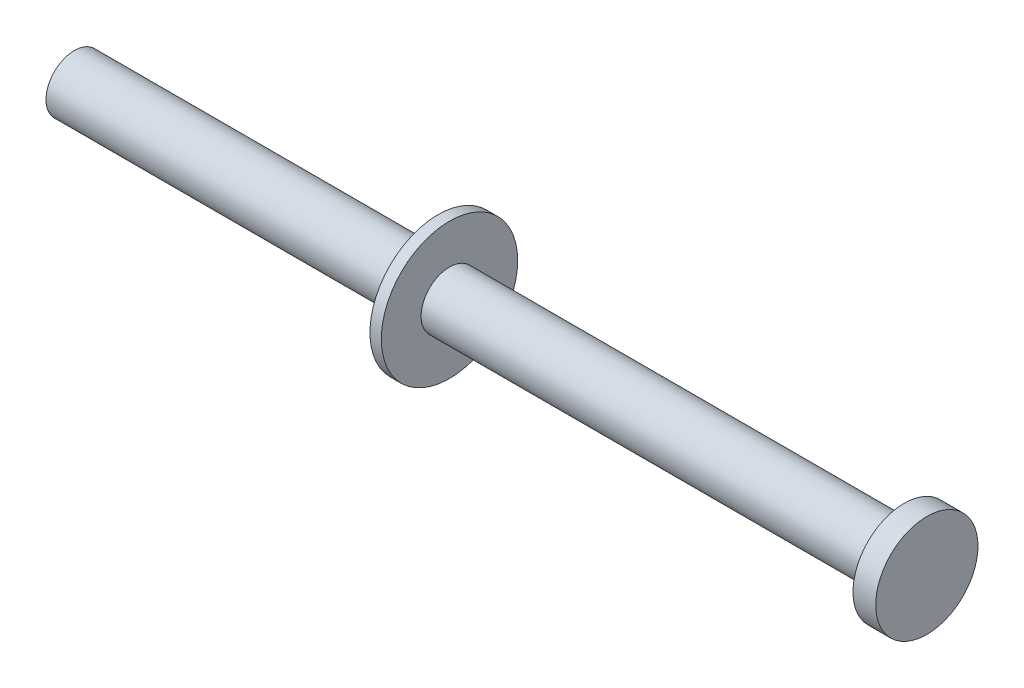
ISO-10303-21;
HEADER;
FILE_DESCRIPTION(('STEP AP214'),'2;1');
FILE_NAME('part.step','',(''),(''),'','','');
FILE_SCHEMA(('AUTOMOTIVE_DESIGN { 1 0 10303 214 1 1 1 1 }'));
ENDSEC;
DATA;
#1=APPLICATION_CONTEXT('core data for automotive mechanical design processes');
#2=APPLICATION_PROTOCOL_DEFINITION('international standard','automotive_design',2000,#1);
#3=PRODUCT_CONTEXT('',#1,'mechanical');
#4=PRODUCT('Part','Part','',(#3));
#5=PRODUCT_RELATED_PRODUCT_CATEGORY('part','',(#4));
#6=PRODUCT_DEFINITION_FORMATION('','',#4);
#7=PRODUCT_DEFINITION_CONTEXT('part definition',#1,'design');
#8=PRODUCT_DEFINITION('design','',#6,#7);
#9=PRODUCT_DEFINITION_SHAPE('','',#8);
#10=(LENGTH_UNIT() NAMED_UNIT(*) SI_UNIT(.MILLI.,.METRE.));
#11=(NAMED_UNIT(*) PLANE_ANGLE_UNIT() SI_UNIT($,.RADIAN.));
#12=(NAMED_UNIT(*) SI_UNIT($,.STERADIAN.) SOLID_ANGLE_UNIT());
#13=UNCERTAINTY_MEASURE_WITH_UNIT(LENGTH_MEASURE(1.E-05),#10,'distance_accuracy_value','');
#14=(GEOMETRIC_REPRESENTATION_CONTEXT(3) GLOBAL_UNCERTAINTY_ASSIGNED_CONTEXT((#13)) GLOBAL_UNIT_ASSIGNED_CONTEXT((#10,
#11,#12)) REPRESENTATION_CONTEXT('',''));
#15=CARTESIAN_POINT('',(0.,0.,0.));
#16=DIRECTION('',(0.,0.,1.));
#17=DIRECTION('',(1.,0.,0.));
#18=AXIS2_PLACEMENT_3D('',#15,#16,#17);
#19=CARTESIAN_POINT('',(4.,0.,0.));
#20=DIRECTION('',(-1.,0.,0.));
#21=DIRECTION('',(0.,0.,1.));
#22=AXIS2_PLACEMENT_3D('',#19,#20,#21);
#23=CYLINDRICAL_SURFACE('',#22,9.);
#24=CARTESIAN_POINT('',(4.,0.,0.));
#25=DIRECTION('',(1.,0.,0.));
#26=DIRECTION('',(0.,0.,-1.));
#27=AXIS2_PLACEMENT_3D('',#24,#25,#26);
#28=CIRCLE('',#27,9.);
#29=CARTESIAN_POINT('',(4.,0.,-9.));
#30=VERTEX_POINT('',#29);
#31=EDGE_CURVE('E45',#30,#30,#28,.T.);
#32=ORIENTED_EDGE('',*,*,#31,.F.);
#33=EDGE_LOOP('',(#32));
#34=FACE_BOUND('',#33,.T.);
#35=CARTESIAN_POINT('',(0.,0.,0.));
#36=DIRECTION('',(1.,0.,0.));
#37=DIRECTION('',(0.,0.,-1.));
#38=AXIS2_PLACEMENT_3D('',#35,#36,#37);
#39=CIRCLE('',#38,9.);
#40=CARTESIAN_POINT('',(0.,0.,-9.));
#41=VERTEX_POINT('',#40);
#42=EDGE_CURVE('E50',#41,#41,#39,.T.);
#43=ORIENTED_EDGE('',*,*,#42,.T.);
#44=EDGE_LOOP('',(#43));
#45=FACE_BOUND('',#44,.T.);
#46=ADVANCED_FACE('F35',(#34,#45),#23,.T.);
#47=CARTESIAN_POINT('',(4.,0.,0.));
#48=DIRECTION('',(1.,0.,0.));
#49=DIRECTION('',(0.,0.,-1.));
#50=AXIS2_PLACEMENT_3D('',#47,#48,#49);
#51=PLANE('',#50);
#52=ORIENTED_EDGE('',*,*,#31,.T.);
#53=EDGE_LOOP('',(#52));
#54=FACE_BOUND('',#53,.T.);
#55=ADVANCED_FACE('F89',(#54),#51,.T.);
#56=CARTESIAN_POINT('',(0.,0.,0.));
#57=DIRECTION('',(1.,0.,0.));
#58=DIRECTION('',(0.,0.,-1.));
#59=AXIS2_PLACEMENT_3D('',#56,#57,#58);
#60=PLANE('',#59);
#61=CARTESIAN_POINT('',(0.,0.,0.));
#62=DIRECTION('',(-1.,0.,0.));
#63=DIRECTION('',(0.,0.,1.));
#64=AXIS2_PLACEMENT_3D('',#61,#62,#63);
#65=CIRCLE('',#64,5.);
#66=CARTESIAN_POINT('',(0.,0.,5.));
#67=VERTEX_POINT('',#66);
#68=EDGE_CURVE('E41',#67,#67,#65,.T.);
#69=ORIENTED_EDGE('',*,*,#68,.F.);
#70=EDGE_LOOP('',(#69));
#71=FACE_BOUND('',#70,.T.);
#72=ORIENTED_EDGE('',*,*,#42,.F.);
#73=EDGE_LOOP('',(#72));
#74=FACE_BOUND('',#73,.T.);
#75=ADVANCED_FACE('F83',(#71,#74),#60,.F.);
#76=CARTESIAN_POINT('',(-146.,0.,0.));
#77=DIRECTION('',(1.,0.,0.));
#78=DIRECTION('',(0.,0.,-1.));
#79=AXIS2_PLACEMENT_3D('',#76,#77,#78);
#80=CYLINDRICAL_SURFACE('',#79,5.);
#81=CARTESIAN_POINT('',(-80.,0.,0.));
#82=DIRECTION('',(1.,0.,0.));
#83=DIRECTION('',(0.,0.,-1.));
#84=AXIS2_PLACEMENT_3D('',#81,#82,#83);
#85=CIRCLE('',#84,5.);
#86=CARTESIAN_POINT('',(-80.,0.,-5.));
#87=VERTEX_POINT('',#86);
#88=EDGE_CURVE('E57',#87,#87,#85,.T.);
#89=ORIENTED_EDGE('',*,*,#88,.T.);
#90=EDGE_LOOP('',(#89));
#91=FACE_BOUND('',#90,.T.);
#92=ORIENTED_EDGE('',*,*,#68,.T.);
#93=EDGE_LOOP('',(#92));
#94=FACE_BOUND('',#93,.T.);
#95=ADVANCED_FACE('F76',(#91,#94),#80,.T.);
#96=CARTESIAN_POINT('',(-82.,0.,0.));
#97=DIRECTION('',(1.,0.,0.));
#98=DIRECTION('',(0.,0.,-1.));
#99=AXIS2_PLACEMENT_3D('',#96,#97,#98);
#100=CYLINDRICAL_SURFACE('',#99,12.);
#101=CARTESIAN_POINT('',(-82.,0.,0.));
#102=DIRECTION('',(1.,0.,0.));
#103=DIRECTION('',(0.,0.,-1.));
#104=AXIS2_PLACEMENT_3D('',#101,#102,#103);
#105=CIRCLE('',#104,12.);
#106=CARTESIAN_POINT('',(-82.,0.,-12.));
#107=VERTEX_POINT('',#106);
#108=EDGE_CURVE('E59',#107,#107,#105,.T.);
#109=ORIENTED_EDGE('',*,*,#108,.T.);
#110=EDGE_LOOP('',(#109));
#111=FACE_BOUND('',#110,.T.);
#112=CARTESIAN_POINT('',(-80.,0.,0.));
#113=DIRECTION('',(1.,0.,0.));
#114=DIRECTION('',(0.,0.,-1.));
#115=AXIS2_PLACEMENT_3D('',#112,#113,#114);
#116=CIRCLE('',#115,12.);
#117=CARTESIAN_POINT('',(-80.,0.,-12.));
#118=VERTEX_POINT('',#117);
#119=EDGE_CURVE('E64',#118,#118,#116,.T.);
#120=ORIENTED_EDGE('',*,*,#119,.F.);
#121=EDGE_LOOP('',(#120));
#122=FACE_BOUND('',#121,.T.);
#123=ADVANCED_FACE('F73',(#111,#122),#100,.T.);
#124=CARTESIAN_POINT('',(-82.,0.,0.));
#125=DIRECTION('',(1.,0.,0.));
#126=DIRECTION('',(0.,0.,-1.));
#127=AXIS2_PLACEMENT_3D('',#124,#125,#126);
#128=PLANE('',#127);
#129=CARTESIAN_POINT('',(-82.,0.,0.));
#130=DIRECTION('',(1.,0.,0.));
#131=DIRECTION('',(0.,0.,-1.));
#132=AXIS2_PLACEMENT_3D('',#129,#130,#131);
#133=CIRCLE('',#132,5.);
#134=CARTESIAN_POINT('',(-82.,0.,-5.));
#135=VERTEX_POINT('',#134);
#136=EDGE_CURVE('E10',#135,#135,#133,.T.);
#137=ORIENTED_EDGE('',*,*,#136,.T.);
#138=EDGE_LOOP('',(#137));
#139=FACE_BOUND('',#138,.T.);
#140=ORIENTED_EDGE('',*,*,#108,.F.);
#141=EDGE_LOOP('',(#140));
#142=FACE_BOUND('',#141,.T.);
#143=ADVANCED_FACE('F75',(#139,#142),#128,.F.);
#144=CARTESIAN_POINT('',(-80.,0.,0.));
#145=DIRECTION('',(1.,0.,0.));
#146=DIRECTION('',(0.,0.,-1.));
#147=AXIS2_PLACEMENT_3D('',#144,#145,#146);
#148=PLANE('',#147);
#149=ORIENTED_EDGE('',*,*,#88,.F.);
#150=EDGE_LOOP('',(#149));
#151=FACE_BOUND('',#150,.T.);
#152=ORIENTED_EDGE('',*,*,#119,.T.);
#153=EDGE_LOOP('',(#152));
#154=FACE_BOUND('',#153,.T.);
#155=ADVANCED_FACE('F71',(#151,#154),#148,.T.);
#156=CARTESIAN_POINT('',(-146.,0.,0.));
#157=DIRECTION('',(-1.,0.,0.));
#158=DIRECTION('',(0.,0.,1.));
#159=AXIS2_PLACEMENT_3D('',#156,#157,#158);
#160=PLANE('',#159);
#161=CARTESIAN_POINT('',(-146.,0.,0.));
#162=DIRECTION('',(-1.,0.,0.));
#163=DIRECTION('',(0.,0.,1.));
#164=AXIS2_PLACEMENT_3D('',#161,#162,#163);
#165=CIRCLE('',#164,5.);
#166=CARTESIAN_POINT('',(-146.,0.,5.));
#167=VERTEX_POINT('',#166);
#168=EDGE_CURVE('E53',#167,#167,#165,.T.);
#169=ORIENTED_EDGE('',*,*,#168,.T.);
#170=EDGE_LOOP('',(#169));
#171=FACE_BOUND('',#170,.T.);
#172=ADVANCED_FACE('F104',(#171),#160,.T.);
#173=ORIENTED_EDGE('',*,*,#168,.F.);
#174=EDGE_LOOP('',(#173));
#175=FACE_BOUND('',#174,.T.);
#176=ORIENTED_EDGE('',*,*,#136,.F.);
#177=EDGE_LOOP('',(#176));
#178=FACE_BOUND('',#177,.T.);
#179=ADVANCED_FACE('F85',(#175,#178),#80,.T.);
#180=CLOSED_SHELL('',(#46,#55,#75,#95,#123,#143,#155,#172,#179));
#181=MANIFOLD_SOLID_BREP('B2',#180);
#182=ADVANCED_BREP_SHAPE_REPRESENTATION('',(#18,#181),#14);
#183=SHAPE_DEFINITION_REPRESENTATION(#9,#182);
ENDSEC;
END-ISO-10303-21;
